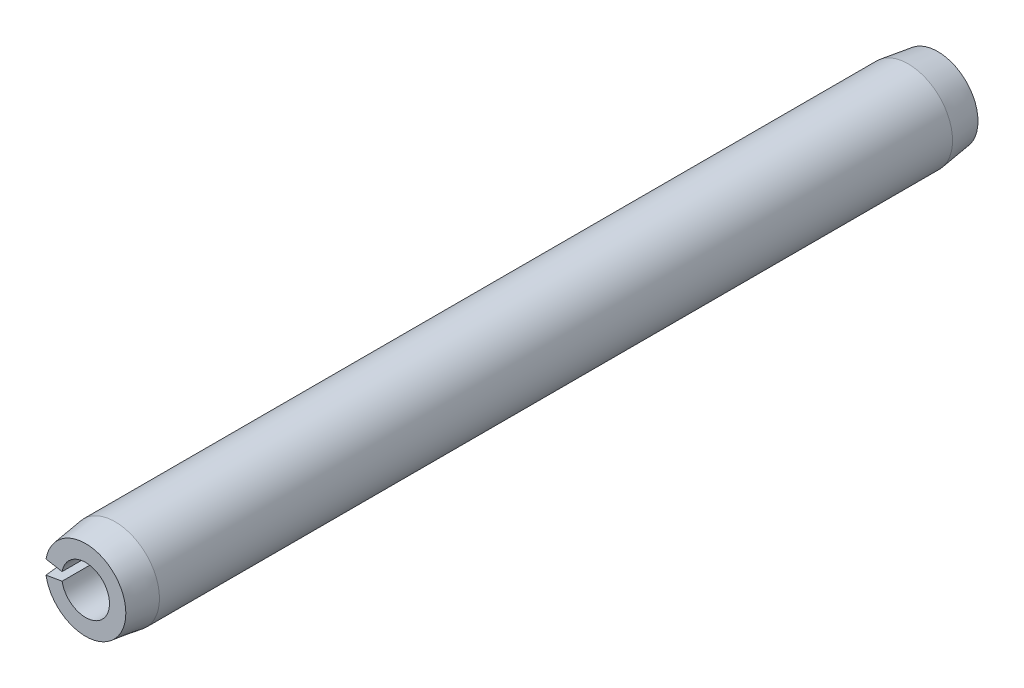
ISO-10303-21;
HEADER;
FILE_DESCRIPTION(('STEP AP214'),'2;1');
FILE_NAME('part.step','',(''),(''),'','','');
FILE_SCHEMA(('AUTOMOTIVE_DESIGN { 1 0 10303 214 1 1 1 1 }'));
ENDSEC;
DATA;
#1=APPLICATION_CONTEXT('core data for automotive mechanical design processes');
#2=APPLICATION_PROTOCOL_DEFINITION('international standard','automotive_design',2000,#1);
#3=PRODUCT_CONTEXT('',#1,'mechanical');
#4=PRODUCT('Part','Part','',(#3));
#5=PRODUCT_RELATED_PRODUCT_CATEGORY('part','',(#4));
#6=PRODUCT_DEFINITION_FORMATION('','',#4);
#7=PRODUCT_DEFINITION_CONTEXT('part definition',#1,'design');
#8=PRODUCT_DEFINITION('design','',#6,#7);
#9=PRODUCT_DEFINITION_SHAPE('','',#8);
#10=(LENGTH_UNIT() NAMED_UNIT(*) SI_UNIT(.MILLI.,.METRE.));
#11=(NAMED_UNIT(*) PLANE_ANGLE_UNIT() SI_UNIT($,.RADIAN.));
#12=(NAMED_UNIT(*) SI_UNIT($,.STERADIAN.) SOLID_ANGLE_UNIT());
#13=UNCERTAINTY_MEASURE_WITH_UNIT(LENGTH_MEASURE(1.E-05),#10,'distance_accuracy_value','');
#14=(GEOMETRIC_REPRESENTATION_CONTEXT(3) GLOBAL_UNCERTAINTY_ASSIGNED_CONTEXT((#13)) GLOBAL_UNIT_ASSIGNED_CONTEXT((#10,
#11,#12)) REPRESENTATION_CONTEXT('',''));
#15=CARTESIAN_POINT('',(0.,0.,0.));
#16=DIRECTION('',(0.,0.,1.));
#17=DIRECTION('',(1.,0.,0.));
#18=AXIS2_PLACEMENT_3D('',#15,#16,#17);
#19=CARTESIAN_POINT('',(0.,0.,9.525));
#20=DIRECTION('',(0.,0.,1.));
#21=DIRECTION('',(1.,0.,0.));
#22=AXIS2_PLACEMENT_3D('',#19,#20,#21);
#23=PLANE('',#22);
#24=CARTESIAN_POINT('',(0.,0.,9.525));
#25=DIRECTION('',(0.,0.,-1.));
#26=DIRECTION('',(-1.,0.,0.));
#27=AXIS2_PLACEMENT_3D('',#24,#25,#26);
#28=CIRCLE('',#27,0.899160000000005);
#29=CARTESIAN_POINT('',(-0.885499739198461,0.156137495430995,9.525));
#30=VERTEX_POINT('',#29);
#31=CARTESIAN_POINT('',(-0.885499739198463,-0.156137495430995,9.525));
#32=VERTEX_POINT('',#31);
#33=EDGE_CURVE('E114',#30,#32,#28,.T.);
#34=ORIENTED_EDGE('',*,*,#33,.F.);
#35=DIRECTION('',(0.984807753012209,-0.173648177666927,0.));
#36=VECTOR('',#35,1.);
#37=CARTESIAN_POINT('',(-0.975550560133894,0.172015884796858,9.525));
#38=LINE('',#37,#36);
#39=CARTESIAN_POINT('',(-0.525296455456712,0.0926239379675387,9.525));
#40=VERTEX_POINT('',#39);
#41=EDGE_CURVE('E135',#30,#40,#38,.T.);
#42=ORIENTED_EDGE('',*,*,#41,.T.);
#43=CARTESIAN_POINT('',(0.,0.,9.525));
#44=DIRECTION('',(0.,0.,-1.));
#45=DIRECTION('',(1.,0.,0.));
#46=AXIS2_PLACEMENT_3D('',#43,#44,#45);
#47=CIRCLE('',#46,0.5334);
#48=CARTESIAN_POINT('',(-0.525296455456712,-0.0926239379675386,9.525));
#49=VERTEX_POINT('',#48);
#50=EDGE_CURVE('E134',#40,#49,#47,.T.);
#51=ORIENTED_EDGE('',*,*,#50,.T.);
#52=DIRECTION('',(-0.984807753012209,-0.173648177666927,0.));
#53=VECTOR('',#52,1.);
#54=CARTESIAN_POINT('',(-0.525296455456712,-0.0926239379675386,9.525));
#55=LINE('',#54,#53);
#56=EDGE_CURVE('E128',#49,#32,#55,.T.);
#57=ORIENTED_EDGE('',*,*,#56,.T.);
#58=EDGE_LOOP('',(#34,#42,#51,#57));
#59=FACE_BOUND('',#58,.T.);
#60=ADVANCED_FACE('F62',(#59),#23,.T.);
#61=CARTESIAN_POINT('',(0.,0.,-9.525));
#62=DIRECTION('',(0.,0.,1.));
#63=DIRECTION('',(1.,0.,0.));
#64=AXIS2_PLACEMENT_3D('',#61,#62,#63);
#65=CYLINDRICAL_SURFACE('',#64,0.5334);
#66=DIRECTION('',(0.,0.,1.));
#67=VECTOR('',#66,1.);
#68=CARTESIAN_POINT('',(-0.525296455456712,-0.0926239379675386,-9.525));
#69=LINE('',#68,#67);
#70=CARTESIAN_POINT('',(-0.525296455456712,-0.0926239379675386,-9.525));
#71=VERTEX_POINT('',#70);
#72=EDGE_CURVE('E66',#71,#49,#69,.T.);
#73=ORIENTED_EDGE('',*,*,#72,.T.);
#74=ORIENTED_EDGE('',*,*,#50,.F.);
#75=DIRECTION('',(0.,0.,1.));
#76=VECTOR('',#75,1.);
#77=CARTESIAN_POINT('',(-0.525296455456712,0.0926239379675387,-9.525));
#78=LINE('',#77,#76);
#79=CARTESIAN_POINT('',(-0.525296455456712,0.0926239379675387,-9.525));
#80=VERTEX_POINT('',#79);
#81=EDGE_CURVE('E12',#80,#40,#78,.T.);
#82=ORIENTED_EDGE('',*,*,#81,.F.);
#83=CARTESIAN_POINT('',(0.,0.,-9.525));
#84=DIRECTION('',(0.,0.,-1.));
#85=DIRECTION('',(1.,0.,0.));
#86=AXIS2_PLACEMENT_3D('',#83,#84,#85);
#87=CIRCLE('',#86,0.5334);
#88=EDGE_CURVE('E137',#80,#71,#87,.T.);
#89=ORIENTED_EDGE('',*,*,#88,.T.);
#90=EDGE_LOOP('',(#73,#74,#82,#89));
#91=FACE_BOUND('',#90,.T.);
#92=ADVANCED_FACE('F64',(#91),#65,.F.);
#93=CARTESIAN_POINT('',(-0.975550560133894,0.172015884796858,-9.525));
#94=DIRECTION('',(-0.173648177666927,-0.984807753012209,0.));
#95=DIRECTION('',(0.984807753012209,-0.173648177666927,0.));
#96=AXIS2_PLACEMENT_3D('',#93,#94,#95);
#97=PLANE('',#96);
#98=DIRECTION('',(-0.135069395335854,0.0238163786656886,-0.990549866766363));
#99=VECTOR('',#98,1.);
#100=CARTESIAN_POINT('',(0.,0.,16.0189333333334));
#101=LINE('',#100,#99);
#102=CARTESIAN_POINT('',(-0.975550560133898,0.172015884796858,8.8646));
#103=VERTEX_POINT('',#102);
#104=EDGE_CURVE('E79',#103,#30,#101,.F.);
#105=ORIENTED_EDGE('',*,*,#104,.F.);
#106=DIRECTION('',(0.,0.,1.));
#107=VECTOR('',#106,1.);
#108=CARTESIAN_POINT('',(-0.975550560133894,0.172015884796858,-9.525));
#109=LINE('',#108,#107);
#110=CARTESIAN_POINT('',(-0.975550560133898,0.172015884796858,-8.8646));
#111=VERTEX_POINT('',#110);
#112=EDGE_CURVE('E71',#111,#103,#109,.T.);
#113=ORIENTED_EDGE('',*,*,#112,.F.);
#114=DIRECTION('',(0.135069395335854,-0.0238163786656886,-0.990549866766363));
#115=VECTOR('',#114,1.);
#116=CARTESIAN_POINT('',(0.,0.,-16.0189333333334));
#117=LINE('',#116,#115);
#118=CARTESIAN_POINT('',(-0.885499739198461,0.156137495430995,-9.525));
#119=VERTEX_POINT('',#118);
#120=EDGE_CURVE('E139',#119,#111,#117,.F.);
#121=ORIENTED_EDGE('',*,*,#120,.F.);
#122=DIRECTION('',(0.984807753012209,-0.173648177666927,0.));
#123=VECTOR('',#122,1.);
#124=CARTESIAN_POINT('',(-0.975550560133894,0.172015884796858,-9.525));
#125=LINE('',#124,#123);
#126=EDGE_CURVE('E148',#119,#80,#125,.T.);
#127=ORIENTED_EDGE('',*,*,#126,.T.);
#128=ORIENTED_EDGE('',*,*,#81,.T.);
#129=ORIENTED_EDGE('',*,*,#41,.F.);
#130=EDGE_LOOP('',(#105,#113,#121,#127,#128,#129));
#131=FACE_BOUND('',#130,.T.);
#132=ADVANCED_FACE('F171',(#131),#97,.T.);
#133=CARTESIAN_POINT('',(0.,0.,-9.525));
#134=DIRECTION('',(0.,0.,1.));
#135=DIRECTION('',(1.,0.,0.));
#136=AXIS2_PLACEMENT_3D('',#133,#134,#135);
#137=CYLINDRICAL_SURFACE('',#136,0.9906);
#138=CARTESIAN_POINT('',(0.,0.,8.8646));
#139=DIRECTION('',(0.,0.,-1.));
#140=DIRECTION('',(-1.,0.,0.));
#141=AXIS2_PLACEMENT_3D('',#138,#139,#140);
#142=CIRCLE('',#141,0.990600000000004);
#143=CARTESIAN_POINT('',(-0.975550560133899,-0.172015884796859,8.8646));
#144=VERTEX_POINT('',#143);
#145=EDGE_CURVE('E122',#103,#144,#142,.T.);
#146=ORIENTED_EDGE('',*,*,#145,.T.);
#147=DIRECTION('',(0.,0.,1.));
#148=VECTOR('',#147,1.);
#149=CARTESIAN_POINT('',(-0.975550560133894,-0.172015884796858,-9.525));
#150=LINE('',#149,#148);
#151=CARTESIAN_POINT('',(-0.975550560133899,-0.172015884796859,-8.8646));
#152=VERTEX_POINT('',#151);
#153=EDGE_CURVE('E131',#152,#144,#150,.T.);
#154=ORIENTED_EDGE('',*,*,#153,.F.);
#155=CARTESIAN_POINT('',(0.,0.,-8.8646));
#156=DIRECTION('',(0.,0.,-1.));
#157=DIRECTION('',(-1.,0.,0.));
#158=AXIS2_PLACEMENT_3D('',#155,#156,#157);
#159=CIRCLE('',#158,0.990600000000004);
#160=EDGE_CURVE('E160',#111,#152,#159,.T.);
#161=ORIENTED_EDGE('',*,*,#160,.F.);
#162=ORIENTED_EDGE('',*,*,#112,.T.);
#163=EDGE_LOOP('',(#146,#154,#161,#162));
#164=FACE_BOUND('',#163,.T.);
#165=ADVANCED_FACE('F170',(#164),#137,.T.);
#166=CARTESIAN_POINT('',(-0.525296455456712,-0.0926239379675386,-9.525));
#167=DIRECTION('',(-0.173648177666927,0.984807753012208,0.));
#168=DIRECTION('',(-0.984807753012209,-0.173648177666927,0.));
#169=AXIS2_PLACEMENT_3D('',#166,#167,#168);
#170=PLANE('',#169);
#171=DIRECTION('',(0.135069395335854,0.0238163786656887,0.990549866766363));
#172=VECTOR('',#171,1.);
#173=CARTESIAN_POINT('',(0.,0.,16.0189333333334));
#174=LINE('',#173,#172);
#175=EDGE_CURVE('E117',#32,#144,#174,.F.);
#176=ORIENTED_EDGE('',*,*,#175,.F.);
#177=ORIENTED_EDGE('',*,*,#56,.F.);
#178=ORIENTED_EDGE('',*,*,#72,.F.);
#179=DIRECTION('',(-0.984807753012209,-0.173648177666927,0.));
#180=VECTOR('',#179,1.);
#181=CARTESIAN_POINT('',(-0.525296455456712,-0.0926239379675386,-9.525));
#182=LINE('',#181,#180);
#183=CARTESIAN_POINT('',(-0.885499739198463,-0.156137495430995,-9.525));
#184=VERTEX_POINT('',#183);
#185=EDGE_CURVE('E145',#71,#184,#182,.T.);
#186=ORIENTED_EDGE('',*,*,#185,.T.);
#187=DIRECTION('',(-0.135069395335854,-0.0238163786656887,0.990549866766363));
#188=VECTOR('',#187,1.);
#189=CARTESIAN_POINT('',(0.,0.,-16.0189333333334));
#190=LINE('',#189,#188);
#191=EDGE_CURVE('E87',#152,#184,#190,.F.);
#192=ORIENTED_EDGE('',*,*,#191,.F.);
#193=ORIENTED_EDGE('',*,*,#153,.T.);
#194=EDGE_LOOP('',(#176,#177,#178,#186,#192,#193));
#195=FACE_BOUND('',#194,.T.);
#196=ADVANCED_FACE('F127',(#195),#170,.T.);
#197=CARTESIAN_POINT('',(0.,0.,-9.525));
#198=DIRECTION('',(0.,0.,1.));
#199=DIRECTION('',(1.,0.,0.));
#200=AXIS2_PLACEMENT_3D('',#197,#198,#199);
#201=PLANE('',#200);
#202=ORIENTED_EDGE('',*,*,#126,.F.);
#203=CARTESIAN_POINT('',(0.,0.,-9.525));
#204=DIRECTION('',(0.,0.,-1.));
#205=DIRECTION('',(-1.,0.,0.));
#206=AXIS2_PLACEMENT_3D('',#203,#204,#205);
#207=CIRCLE('',#206,0.899160000000005);
#208=EDGE_CURVE('E158',#119,#184,#207,.T.);
#209=ORIENTED_EDGE('',*,*,#208,.T.);
#210=ORIENTED_EDGE('',*,*,#185,.F.);
#211=ORIENTED_EDGE('',*,*,#88,.F.);
#212=EDGE_LOOP('',(#202,#209,#210,#211));
#213=FACE_BOUND('',#212,.T.);
#214=ADVANCED_FACE('F157',(#213),#201,.F.);
#215=CARTESIAN_POINT('',(0.,0.,-8.8646));
#216=DIRECTION('',(0.,0.,1.));
#217=DIRECTION('',(1.,0.,0.));
#218=AXIS2_PLACEMENT_3D('',#215,#216,#217);
#219=CONICAL_SURFACE('',#218,0.990600000000004,0.137586736470349);
#220=ORIENTED_EDGE('',*,*,#120,.T.);
#221=ORIENTED_EDGE('',*,*,#160,.T.);
#222=ORIENTED_EDGE('',*,*,#191,.T.);
#223=ORIENTED_EDGE('',*,*,#208,.F.);
#224=EDGE_LOOP('',(#220,#221,#222,#223));
#225=FACE_BOUND('',#224,.T.);
#226=ADVANCED_FACE('F166',(#225),#219,.T.);
#227=CARTESIAN_POINT('',(0.,0.,8.8646));
#228=DIRECTION('',(0.,0.,-1.));
#229=DIRECTION('',(1.,0.,0.));
#230=AXIS2_PLACEMENT_3D('',#227,#228,#229);
#231=CONICAL_SURFACE('',#230,0.990600000000004,0.137586736470349);
#232=ORIENTED_EDGE('',*,*,#104,.T.);
#233=ORIENTED_EDGE('',*,*,#33,.T.);
#234=ORIENTED_EDGE('',*,*,#175,.T.);
#235=ORIENTED_EDGE('',*,*,#145,.F.);
#236=EDGE_LOOP('',(#232,#233,#234,#235));
#237=FACE_BOUND('',#236,.T.);
#238=ADVANCED_FACE('F116',(#237),#231,.T.);
#239=CLOSED_SHELL('',(#60,#92,#132,#165,#196,#214,#226,#238));
#240=MANIFOLD_SOLID_BREP('B2',#239);
#241=ADVANCED_BREP_SHAPE_REPRESENTATION('',(#18,#240),#14);
#242=SHAPE_DEFINITION_REPRESENTATION(#9,#241);
ENDSEC;
END-ISO-10303-21;
